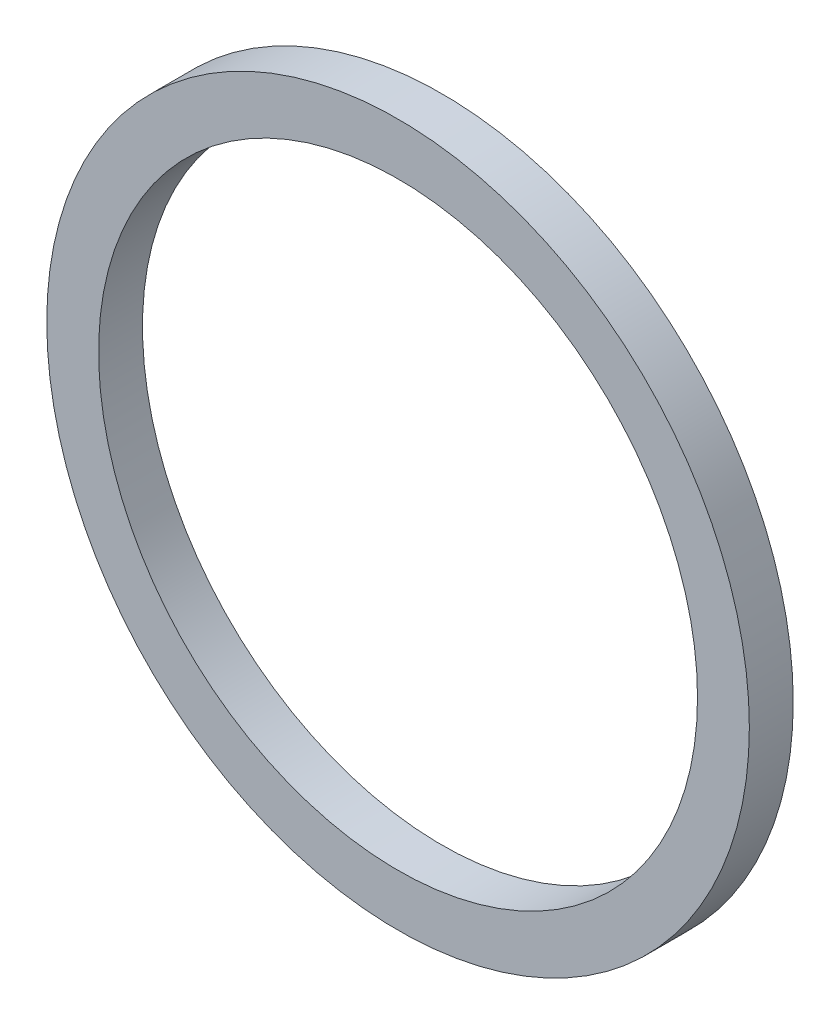
ISO-10303-21;
HEADER;
FILE_DESCRIPTION(('STEP AP214'),'2;1');
FILE_NAME('part.step','',(''),(''),'','','');
FILE_SCHEMA(('AUTOMOTIVE_DESIGN { 1 0 10303 214 1 1 1 1 }'));
ENDSEC;
DATA;
#1=APPLICATION_CONTEXT('core data for automotive mechanical design processes');
#2=APPLICATION_PROTOCOL_DEFINITION('international standard','automotive_design',2000,#1);
#3=PRODUCT_CONTEXT('',#1,'mechanical');
#4=PRODUCT('Part','Part','',(#3));
#5=PRODUCT_RELATED_PRODUCT_CATEGORY('part','',(#4));
#6=PRODUCT_DEFINITION_FORMATION('','',#4);
#7=PRODUCT_DEFINITION_CONTEXT('part definition',#1,'design');
#8=PRODUCT_DEFINITION('design','',#6,#7);
#9=PRODUCT_DEFINITION_SHAPE('','',#8);
#10=(LENGTH_UNIT() NAMED_UNIT(*) SI_UNIT(.MILLI.,.METRE.));
#11=(NAMED_UNIT(*) PLANE_ANGLE_UNIT() SI_UNIT($,.RADIAN.));
#12=(NAMED_UNIT(*) SI_UNIT($,.STERADIAN.) SOLID_ANGLE_UNIT());
#13=UNCERTAINTY_MEASURE_WITH_UNIT(LENGTH_MEASURE(1.E-05),#10,'distance_accuracy_value','');
#14=(GEOMETRIC_REPRESENTATION_CONTEXT(3) GLOBAL_UNCERTAINTY_ASSIGNED_CONTEXT((#13)) GLOBAL_UNIT_ASSIGNED_CONTEXT((#10,
#11,#12)) REPRESENTATION_CONTEXT('',''));
#15=CARTESIAN_POINT('',(0.,0.,0.));
#16=DIRECTION('',(0.,0.,1.));
#17=DIRECTION('',(1.,0.,0.));
#18=AXIS2_PLACEMENT_3D('',#15,#16,#17);
#19=CARTESIAN_POINT('',(0.,0.,-19.05));
#20=DIRECTION('',(0.,0.,1.));
#21=DIRECTION('',(1.,0.,0.));
#22=AXIS2_PLACEMENT_3D('',#19,#20,#21);
#23=CYLINDRICAL_SURFACE('',#22,305.);
#24=CARTESIAN_POINT('',(0.,0.,-19.05));
#25=DIRECTION('',(0.,0.,1.));
#26=DIRECTION('',(1.,0.,0.));
#27=AXIS2_PLACEMENT_3D('',#24,#25,#26);
#28=CIRCLE('',#27,305.);
#29=CARTESIAN_POINT('',(305.,0.,-19.05));
#30=VERTEX_POINT('',#29);
#31=EDGE_CURVE('E11',#30,#30,#28,.T.);
#32=CARTESIAN_POINT('',(0.,0.,19.05));
#33=DIRECTION('',(0.,0.,1.));
#34=DIRECTION('',(1.,0.,0.));
#35=AXIS2_PLACEMENT_3D('',#32,#33,#34);
#36=CIRCLE('',#35,305.);
#37=CARTESIAN_POINT('',(305.,0.,19.05));
#38=VERTEX_POINT('',#37);
#39=EDGE_CURVE('E61',#38,#38,#36,.T.);
#40=CARTESIAN_POINT('',(305.,0.,-19.05));
#41=CARTESIAN_POINT('',(305.,0.,-18.653125));
#42=CARTESIAN_POINT('',(305.,0.,-18.25625));
#43=CARTESIAN_POINT('',(305.,0.,-17.4625));
#44=CARTESIAN_POINT('',(305.,0.,-17.065625));
#45=CARTESIAN_POINT('',(305.,0.,-16.271875));
#46=CARTESIAN_POINT('',(305.,0.,-15.875));
#47=CARTESIAN_POINT('',(305.,0.,-15.08125));
#48=CARTESIAN_POINT('',(305.,0.,-14.684375));
#49=CARTESIAN_POINT('',(305.,0.,-13.890625));
#50=CARTESIAN_POINT('',(305.,0.,-13.49375));
#51=CARTESIAN_POINT('',(305.,0.,-12.7));
#52=CARTESIAN_POINT('',(305.,0.,-12.303125));
#53=CARTESIAN_POINT('',(305.,0.,-11.509375));
#54=CARTESIAN_POINT('',(305.,0.,-11.1125));
#55=CARTESIAN_POINT('',(305.,0.,-10.31875));
#56=CARTESIAN_POINT('',(305.,0.,-9.921875));
#57=CARTESIAN_POINT('',(305.,0.,-9.128125));
#58=CARTESIAN_POINT('',(305.,0.,-8.73125));
#59=CARTESIAN_POINT('',(305.,0.,-7.9375));
#60=CARTESIAN_POINT('',(305.,0.,-7.540625));
#61=CARTESIAN_POINT('',(305.,0.,-6.746875));
#62=CARTESIAN_POINT('',(305.,0.,-6.35));
#63=CARTESIAN_POINT('',(305.,0.,-5.55625));
#64=CARTESIAN_POINT('',(305.,0.,-5.159375));
#65=CARTESIAN_POINT('',(305.,0.,-4.365625));
#66=CARTESIAN_POINT('',(305.,0.,-3.96875));
#67=CARTESIAN_POINT('',(305.,0.,-3.175));
#68=CARTESIAN_POINT('',(305.,0.,-2.778125));
#69=CARTESIAN_POINT('',(305.,0.,-1.984375));
#70=CARTESIAN_POINT('',(305.,0.,-1.5875));
#71=CARTESIAN_POINT('',(305.,0.,-0.79375));
#72=CARTESIAN_POINT('',(305.,0.,-0.396875));
#73=CARTESIAN_POINT('',(305.,0.,0.396875));
#74=CARTESIAN_POINT('',(305.,0.,0.79375));
#75=CARTESIAN_POINT('',(305.,0.,1.5875));
#76=CARTESIAN_POINT('',(305.,0.,1.984375));
#77=CARTESIAN_POINT('',(305.,0.,2.778125));
#78=CARTESIAN_POINT('',(305.,0.,3.175));
#79=CARTESIAN_POINT('',(305.,0.,3.96875));
#80=CARTESIAN_POINT('',(305.,0.,4.365625));
#81=CARTESIAN_POINT('',(305.,0.,5.159375));
#82=CARTESIAN_POINT('',(305.,0.,5.55625));
#83=CARTESIAN_POINT('',(305.,0.,6.35));
#84=CARTESIAN_POINT('',(305.,0.,6.746875));
#85=CARTESIAN_POINT('',(305.,0.,7.540625));
#86=CARTESIAN_POINT('',(305.,0.,7.9375));
#87=CARTESIAN_POINT('',(305.,0.,8.73125));
#88=CARTESIAN_POINT('',(305.,0.,9.128125));
#89=CARTESIAN_POINT('',(305.,0.,9.921875));
#90=CARTESIAN_POINT('',(305.,0.,10.31875));
#91=CARTESIAN_POINT('',(305.,0.,11.1125));
#92=CARTESIAN_POINT('',(305.,0.,11.509375));
#93=CARTESIAN_POINT('',(305.,0.,12.303125));
#94=CARTESIAN_POINT('',(305.,0.,12.7));
#95=CARTESIAN_POINT('',(305.,0.,13.49375));
#96=CARTESIAN_POINT('',(305.,0.,13.890625));
#97=CARTESIAN_POINT('',(305.,0.,14.684375));
#98=CARTESIAN_POINT('',(305.,0.,15.08125));
#99=CARTESIAN_POINT('',(305.,0.,15.875));
#100=CARTESIAN_POINT('',(305.,0.,16.271875));
#101=CARTESIAN_POINT('',(305.,0.,17.065625));
#102=CARTESIAN_POINT('',(305.,0.,17.4625));
#103=CARTESIAN_POINT('',(305.,0.,18.25625));
#104=CARTESIAN_POINT('',(305.,0.,18.653125));
#105=CARTESIAN_POINT('',(305.,0.,19.05));
#106=B_SPLINE_CURVE_WITH_KNOTS('',3,(#40,#41,#42,#43,#44,#45,#46,#47,#48,#49,#50,#51,#52,#53,
#54,#55,#56,#57,#58,#59,#60,#61,#62,#63,#64,#65,#66,#67,#68,#69,#70,#71,#72,#73,#74,#75,#76,#77,
#78,#79,#80,#81,#82,#83,#84,#85,#86,#87,#88,#89,#90,#91,#92,#93,#94,#95,#96,#97,#98,#99,#100,
#101,#102,#103,#104,#105),.UNSPECIFIED.,.F.,.F.,(4,2,2,2,2,2,2,2,2,2,2,2,2,2,2,2,2,2,2,2,2,2,2,
2,2,2,2,2,2,2,2,2,4),(0.,1.190625,2.38125,3.571875,4.7625,5.953125,7.14375,8.334375,9.525,
10.715625,11.90625,13.096875,14.2875,15.478125,16.66875,17.859375,19.05,20.240625,21.43125,
22.621875,23.8125,25.003125,26.19375,27.384375,28.575,29.765625,30.95625,32.146875,33.3375,
34.528125,35.71875,36.909375,38.1),.UNSPECIFIED.);
#107=EDGE_CURVE('BSEAM51',#30,#38,#106,.T.);
#108=ORIENTED_EDGE('',*,*,#31,.T.);
#109=ORIENTED_EDGE('',*,*,#39,.F.);
#110=ORIENTED_EDGE('',*,*,#107,.T.);
#111=ORIENTED_EDGE('',*,*,#107,.F.);
#112=EDGE_LOOP('',(#108,#110,#109,#111));
#113=FACE_BOUND('',#112,.T.);
#114=ADVANCED_FACE('F51',(#113),#23,.T.);
#115=CARTESIAN_POINT('',(0.,0.,-19.05));
#116=DIRECTION('',(0.,0.,1.));
#117=DIRECTION('',(1.,0.,0.));
#118=AXIS2_PLACEMENT_3D('',#115,#116,#117);
#119=PLANE('',#118);
#120=CARTESIAN_POINT('',(0.,0.,-19.05));
#121=DIRECTION('',(0.,0.,1.));
#122=DIRECTION('',(1.,0.,0.));
#123=AXIS2_PLACEMENT_3D('',#120,#121,#122);
#124=CIRCLE('',#123,260.);
#125=CARTESIAN_POINT('',(260.,0.,-19.05));
#126=VERTEX_POINT('',#125);
#127=EDGE_CURVE('E57',#126,#126,#124,.T.);
#128=ORIENTED_EDGE('',*,*,#127,.T.);
#129=EDGE_LOOP('',(#128));
#130=FACE_BOUND('',#129,.T.);
#131=ORIENTED_EDGE('',*,*,#31,.F.);
#132=EDGE_LOOP('',(#131));
#133=FACE_BOUND('',#132,.T.);
#134=ADVANCED_FACE('F80',(#130,#133),#119,.F.);
#135=CARTESIAN_POINT('',(0.,0.,-19.05));
#136=DIRECTION('',(0.,0.,1.));
#137=DIRECTION('',(1.,0.,0.));
#138=AXIS2_PLACEMENT_3D('',#135,#136,#137);
#139=CYLINDRICAL_SURFACE('',#138,260.);
#140=CARTESIAN_POINT('',(0.,0.,19.05));
#141=DIRECTION('',(0.,0.,1.));
#142=DIRECTION('',(1.,0.,0.));
#143=AXIS2_PLACEMENT_3D('',#140,#141,#142);
#144=CIRCLE('',#143,260.);
#145=CARTESIAN_POINT('',(260.,0.,19.05));
#146=VERTEX_POINT('',#145);
#147=EDGE_CURVE('E65',#146,#146,#144,.T.);
#148=CARTESIAN_POINT('',(260.,0.,-19.05));
#149=CARTESIAN_POINT('',(260.,0.,-18.653125));
#150=CARTESIAN_POINT('',(260.,0.,-18.25625));
#151=CARTESIAN_POINT('',(260.,0.,-17.4625));
#152=CARTESIAN_POINT('',(260.,0.,-17.065625));
#153=CARTESIAN_POINT('',(260.,0.,-16.271875));
#154=CARTESIAN_POINT('',(260.,0.,-15.875));
#155=CARTESIAN_POINT('',(260.,0.,-15.08125));
#156=CARTESIAN_POINT('',(260.,0.,-14.684375));
#157=CARTESIAN_POINT('',(260.,0.,-13.890625));
#158=CARTESIAN_POINT('',(260.,0.,-13.49375));
#159=CARTESIAN_POINT('',(260.,0.,-12.7));
#160=CARTESIAN_POINT('',(260.,0.,-12.303125));
#161=CARTESIAN_POINT('',(260.,0.,-11.509375));
#162=CARTESIAN_POINT('',(260.,0.,-11.1125));
#163=CARTESIAN_POINT('',(260.,0.,-10.31875));
#164=CARTESIAN_POINT('',(260.,0.,-9.921875));
#165=CARTESIAN_POINT('',(260.,0.,-9.128125));
#166=CARTESIAN_POINT('',(260.,0.,-8.73125));
#167=CARTESIAN_POINT('',(260.,0.,-7.9375));
#168=CARTESIAN_POINT('',(260.,0.,-7.540625));
#169=CARTESIAN_POINT('',(260.,0.,-6.746875));
#170=CARTESIAN_POINT('',(260.,0.,-6.35));
#171=CARTESIAN_POINT('',(260.,0.,-5.55625));
#172=CARTESIAN_POINT('',(260.,0.,-5.159375));
#173=CARTESIAN_POINT('',(260.,0.,-4.365625));
#174=CARTESIAN_POINT('',(260.,0.,-3.96875));
#175=CARTESIAN_POINT('',(260.,0.,-3.175));
#176=CARTESIAN_POINT('',(260.,0.,-2.778125));
#177=CARTESIAN_POINT('',(260.,0.,-1.984375));
#178=CARTESIAN_POINT('',(260.,0.,-1.5875));
#179=CARTESIAN_POINT('',(260.,0.,-0.79375));
#180=CARTESIAN_POINT('',(260.,0.,-0.396875));
#181=CARTESIAN_POINT('',(260.,0.,0.396875));
#182=CARTESIAN_POINT('',(260.,0.,0.79375));
#183=CARTESIAN_POINT('',(260.,0.,1.5875));
#184=CARTESIAN_POINT('',(260.,0.,1.984375));
#185=CARTESIAN_POINT('',(260.,0.,2.778125));
#186=CARTESIAN_POINT('',(260.,0.,3.175));
#187=CARTESIAN_POINT('',(260.,0.,3.96875));
#188=CARTESIAN_POINT('',(260.,0.,4.365625));
#189=CARTESIAN_POINT('',(260.,0.,5.159375));
#190=CARTESIAN_POINT('',(260.,0.,5.55625));
#191=CARTESIAN_POINT('',(260.,0.,6.35));
#192=CARTESIAN_POINT('',(260.,0.,6.746875));
#193=CARTESIAN_POINT('',(260.,0.,7.540625));
#194=CARTESIAN_POINT('',(260.,0.,7.9375));
#195=CARTESIAN_POINT('',(260.,0.,8.73125));
#196=CARTESIAN_POINT('',(260.,0.,9.128125));
#197=CARTESIAN_POINT('',(260.,0.,9.921875));
#198=CARTESIAN_POINT('',(260.,0.,10.31875));
#199=CARTESIAN_POINT('',(260.,0.,11.1125));
#200=CARTESIAN_POINT('',(260.,0.,11.509375));
#201=CARTESIAN_POINT('',(260.,0.,12.303125));
#202=CARTESIAN_POINT('',(260.,0.,12.7));
#203=CARTESIAN_POINT('',(260.,0.,13.49375));
#204=CARTESIAN_POINT('',(260.,0.,13.890625));
#205=CARTESIAN_POINT('',(260.,0.,14.684375));
#206=CARTESIAN_POINT('',(260.,0.,15.08125));
#207=CARTESIAN_POINT('',(260.,0.,15.875));
#208=CARTESIAN_POINT('',(260.,0.,16.271875));
#209=CARTESIAN_POINT('',(260.,0.,17.065625));
#210=CARTESIAN_POINT('',(260.,0.,17.4625));
#211=CARTESIAN_POINT('',(260.,0.,18.25625));
#212=CARTESIAN_POINT('',(260.,0.,18.653125));
#213=CARTESIAN_POINT('',(260.,0.,19.05));
#214=B_SPLINE_CURVE_WITH_KNOTS('',3,(#148,#149,#150,#151,#152,#153,#154,#155,#156,#157,#158,
#159,#160,#161,#162,#163,#164,#165,#166,#167,#168,#169,#170,#171,#172,#173,#174,#175,#176,#177,
#178,#179,#180,#181,#182,#183,#184,#185,#186,#187,#188,#189,#190,#191,#192,#193,#194,#195,#196,
#197,#198,#199,#200,#201,#202,#203,#204,#205,#206,#207,#208,#209,#210,#211,#212,#213),
.UNSPECIFIED.,.F.,.F.,(4,2,2,2,2,2,2,2,2,2,2,2,2,2,2,2,2,2,2,2,2,2,2,2,2,2,2,2,2,2,2,2,4),(0.,
1.190625,2.38125,3.571875,4.7625,5.953125,7.14375,8.334375,9.525,10.715625,11.90625,13.096875,
14.2875,15.478125,16.66875,17.859375,19.05,20.240625,21.43125,22.621875,23.8125,25.003125,
26.19375,27.384375,28.575,29.765625,30.95625,32.146875,33.3375,34.528125,35.71875,36.909375,
38.1),.UNSPECIFIED.);
#215=EDGE_CURVE('BSEAM71',#126,#146,#214,.T.);
#216=ORIENTED_EDGE('',*,*,#127,.F.);
#217=ORIENTED_EDGE('',*,*,#147,.T.);
#218=ORIENTED_EDGE('',*,*,#215,.T.);
#219=ORIENTED_EDGE('',*,*,#215,.F.);
#220=EDGE_LOOP('',(#216,#218,#217,#219));
#221=FACE_BOUND('',#220,.T.);
#222=ADVANCED_FACE('F71',(#221),#139,.F.);
#223=CARTESIAN_POINT('',(0.,0.,19.05));
#224=DIRECTION('',(0.,0.,1.));
#225=DIRECTION('',(1.,0.,0.));
#226=AXIS2_PLACEMENT_3D('',#223,#224,#225);
#227=PLANE('',#226);
#228=ORIENTED_EDGE('',*,*,#39,.T.);
#229=EDGE_LOOP('',(#228));
#230=FACE_BOUND('',#229,.T.);
#231=ORIENTED_EDGE('',*,*,#147,.F.);
#232=EDGE_LOOP('',(#231));
#233=FACE_BOUND('',#232,.T.);
#234=ADVANCED_FACE('F73',(#230,#233),#227,.T.);
#235=CLOSED_SHELL('',(#114,#134,#222,#234));
#236=MANIFOLD_SOLID_BREP('B2',#235);
#237=ADVANCED_BREP_SHAPE_REPRESENTATION('',(#18,#236),#14);
#238=SHAPE_DEFINITION_REPRESENTATION(#9,#237);
ENDSEC;
END-ISO-10303-21;
